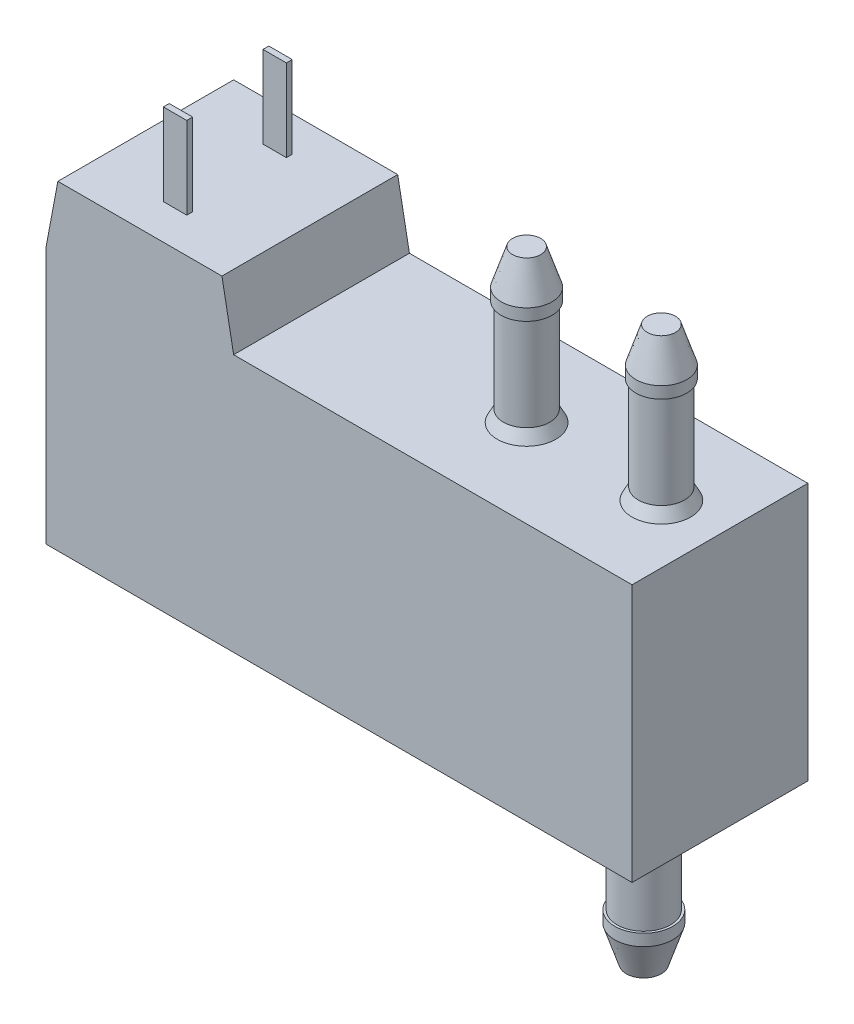
ISO-10303-21;
HEADER;
FILE_DESCRIPTION(('STEP AP214'),'2;1');
FILE_NAME('part.step','',(''),(''),'','','');
FILE_SCHEMA(('AUTOMOTIVE_DESIGN { 1 0 10303 214 1 1 1 1 }'));
ENDSEC;
DATA;
#1=APPLICATION_CONTEXT('core data for automotive mechanical design processes');
#2=APPLICATION_PROTOCOL_DEFINITION('international standard','automotive_design',2000,#1);
#3=PRODUCT_CONTEXT('',#1,'mechanical');
#4=PRODUCT('Part','Part','',(#3));
#5=PRODUCT_RELATED_PRODUCT_CATEGORY('part','',(#4));
#6=PRODUCT_DEFINITION_FORMATION('','',#4);
#7=PRODUCT_DEFINITION_CONTEXT('part definition',#1,'design');
#8=PRODUCT_DEFINITION('design','',#6,#7);
#9=PRODUCT_DEFINITION_SHAPE('','',#8);
#10=(LENGTH_UNIT() NAMED_UNIT(*) SI_UNIT(.MILLI.,.METRE.));
#11=(NAMED_UNIT(*) PLANE_ANGLE_UNIT() SI_UNIT($,.RADIAN.));
#12=(NAMED_UNIT(*) SI_UNIT($,.STERADIAN.) SOLID_ANGLE_UNIT());
#13=UNCERTAINTY_MEASURE_WITH_UNIT(LENGTH_MEASURE(1.E-05),#10,'distance_accuracy_value','');
#14=(GEOMETRIC_REPRESENTATION_CONTEXT(3) GLOBAL_UNCERTAINTY_ASSIGNED_CONTEXT((#13)) GLOBAL_UNIT_ASSIGNED_CONTEXT((#10,
#11,#12)) REPRESENTATION_CONTEXT('',''));
#15=CARTESIAN_POINT('',(0.,0.,0.));
#16=DIRECTION('',(0.,0.,1.));
#17=DIRECTION('',(1.,0.,0.));
#18=AXIS2_PLACEMENT_3D('',#15,#16,#17);
#19=CARTESIAN_POINT('',(-24.,16.3159715500328,24.359998621612));
#20=DIRECTION('',(0.,-1.,0.));
#21=DIRECTION('',(0.,0.,-1.));
#22=AXIS2_PLACEMENT_3D('',#19,#20,#21);
#23=PLANE('',#22);
#24=DIRECTION('',(1.,0.,0.));
#25=VECTOR('',#24,1.);
#26=CARTESIAN_POINT('',(-18.,16.3159715500328,4.));
#27=LINE('',#26,#25);
#28=CARTESIAN_POINT('',(-18.,16.3159715500328,4.));
#29=VERTEX_POINT('',#28);
#30=CARTESIAN_POINT('',(-16.,16.3159715500328,4.));
#31=VERTEX_POINT('',#30);
#32=EDGE_CURVE('E175',#29,#31,#27,.T.);
#33=ORIENTED_EDGE('',*,*,#32,.T.);
#34=DIRECTION('',(0.,0.,1.));
#35=VECTOR('',#34,1.);
#36=CARTESIAN_POINT('',(-16.,16.3159715500328,4.5));
#37=LINE('',#36,#35);
#38=CARTESIAN_POINT('',(-16.,16.3159715500328,4.5));
#39=VERTEX_POINT('',#38);
#40=EDGE_CURVE('E149',#31,#39,#37,.T.);
#41=ORIENTED_EDGE('',*,*,#40,.T.);
#42=DIRECTION('',(-1.,0.,0.));
#43=VECTOR('',#42,1.);
#44=CARTESIAN_POINT('',(-18.,16.3159715500328,4.5));
#45=LINE('',#44,#43);
#46=CARTESIAN_POINT('',(-18.,16.3159715500328,4.5));
#47=VERTEX_POINT('',#46);
#48=EDGE_CURVE('E165',#39,#47,#45,.T.);
#49=ORIENTED_EDGE('',*,*,#48,.T.);
#50=DIRECTION('',(0.,0.,-1.));
#51=VECTOR('',#50,1.);
#52=CARTESIAN_POINT('',(-18.,16.3159715500328,4.5));
#53=LINE('',#52,#51);
#54=EDGE_CURVE('E51',#47,#29,#53,.T.);
#55=ORIENTED_EDGE('',*,*,#54,.T.);
#56=EDGE_LOOP('',(#33,#41,#49,#55));
#57=FACE_BOUND('',#56,.T.);
#58=DIRECTION('',(0.,0.,-1.));
#59=VECTOR('',#58,1.);
#60=CARTESIAN_POINT('',(-24.,16.3159715500328,24.359998621612));
#61=LINE('',#60,#59);
#62=CARTESIAN_POINT('',(-24.,16.3159715500328,7.5));
#63=VERTEX_POINT('',#62);
#64=CARTESIAN_POINT('',(-24.,16.3159715500328,-7.5));
#65=VERTEX_POINT('',#64);
#66=EDGE_CURVE('E268',#63,#65,#61,.T.);
#67=ORIENTED_EDGE('',*,*,#66,.F.);
#68=DIRECTION('',(1.,0.,0.));
#69=VECTOR('',#68,1.);
#70=CARTESIAN_POINT('',(-24.,16.3159715500328,7.5));
#71=LINE('',#70,#69);
#72=CARTESIAN_POINT('',(-10.,16.3159715500328,7.5));
#73=VERTEX_POINT('',#72);
#74=EDGE_CURVE('E271',#63,#73,#71,.T.);
#75=ORIENTED_EDGE('',*,*,#74,.T.);
#76=DIRECTION('',(0.,0.,-1.));
#77=VECTOR('',#76,1.);
#78=CARTESIAN_POINT('',(-10.,16.3159715500328,24.359998621612));
#79=LINE('',#78,#77);
#80=CARTESIAN_POINT('',(-10.,16.3159715500328,-7.5));
#81=VERTEX_POINT('',#80);
#82=EDGE_CURVE('E280',#73,#81,#79,.T.);
#83=ORIENTED_EDGE('',*,*,#82,.T.);
#84=DIRECTION('',(-1.,0.,0.));
#85=VECTOR('',#84,1.);
#86=CARTESIAN_POINT('',(-24.,16.3159715500328,-7.5));
#87=LINE('',#86,#85);
#88=EDGE_CURVE('E264',#81,#65,#87,.T.);
#89=ORIENTED_EDGE('',*,*,#88,.T.);
#90=EDGE_LOOP('',(#67,#75,#83,#89));
#91=FACE_BOUND('',#90,.T.);
#92=DIRECTION('',(0.,0.,-1.));
#93=VECTOR('',#92,1.);
#94=CARTESIAN_POINT('',(-16.,16.3159715500328,-4.5));
#95=LINE('',#94,#93);
#96=CARTESIAN_POINT('',(-16.,16.3159715500328,-4.));
#97=VERTEX_POINT('',#96);
#98=CARTESIAN_POINT('',(-16.,16.3159715500328,-4.5));
#99=VERTEX_POINT('',#98);
#100=EDGE_CURVE('E154',#97,#99,#95,.T.);
#101=ORIENTED_EDGE('',*,*,#100,.F.);
#102=DIRECTION('',(1.,0.,0.));
#103=VECTOR('',#102,1.);
#104=CARTESIAN_POINT('',(-18.,16.3159715500328,-4.));
#105=LINE('',#104,#103);
#106=CARTESIAN_POINT('',(-18.,16.3159715500328,-4.));
#107=VERTEX_POINT('',#106);
#108=EDGE_CURVE('E188',#107,#97,#105,.T.);
#109=ORIENTED_EDGE('',*,*,#108,.F.);
#110=DIRECTION('',(0.,0.,1.));
#111=VECTOR('',#110,1.);
#112=CARTESIAN_POINT('',(-18.,16.3159715500328,-4.5));
#113=LINE('',#112,#111);
#114=CARTESIAN_POINT('',(-18.,16.3159715500328,-4.5));
#115=VERTEX_POINT('',#114);
#116=EDGE_CURVE('E198',#115,#107,#113,.T.);
#117=ORIENTED_EDGE('',*,*,#116,.F.);
#118=DIRECTION('',(-1.,0.,0.));
#119=VECTOR('',#118,1.);
#120=CARTESIAN_POINT('',(-18.,16.3159715500328,-4.5));
#121=LINE('',#120,#119);
#122=EDGE_CURVE('E59',#99,#115,#121,.T.);
#123=ORIENTED_EDGE('',*,*,#122,.F.);
#124=EDGE_LOOP('',(#101,#109,#117,#123));
#125=FACE_BOUND('',#124,.T.);
#126=ADVANCED_FACE('F36',(#57,#91,#125),#23,.F.);
#127=CARTESIAN_POINT('',(-25.,11.,7.5));
#128=DIRECTION('',(0.,-1.,0.));
#129=DIRECTION('',(0.,0.,-1.));
#130=AXIS2_PLACEMENT_3D('',#127,#128,#129);
#131=PLANE('',#130);
#132=CARTESIAN_POINT('',(20.,11.,0.));
#133=DIRECTION('',(0.,-1.,0.));
#134=DIRECTION('',(0.,0.,-1.));
#135=AXIS2_PLACEMENT_3D('',#132,#133,#134);
#136=CIRCLE('',#135,2.5);
#137=CARTESIAN_POINT('',(20.,11.,-2.5));
#138=VERTEX_POINT('',#137);
#139=EDGE_CURVE('E11',#138,#138,#136,.F.);
#140=ORIENTED_EDGE('',*,*,#139,.F.);
#141=EDGE_LOOP('',(#140));
#142=FACE_BOUND('',#141,.T.);
#143=CARTESIAN_POINT('',(8.5,11.,0.));
#144=DIRECTION('',(0.,-1.,0.));
#145=DIRECTION('',(0.,0.,-1.));
#146=AXIS2_PLACEMENT_3D('',#143,#144,#145);
#147=CIRCLE('',#146,2.5);
#148=CARTESIAN_POINT('',(8.5,11.,-2.5));
#149=VERTEX_POINT('',#148);
#150=EDGE_CURVE('E44',#149,#149,#147,.F.);
#151=ORIENTED_EDGE('',*,*,#150,.F.);
#152=EDGE_LOOP('',(#151));
#153=FACE_BOUND('',#152,.T.);
#154=DIRECTION('',(0.,0.,-1.));
#155=VECTOR('',#154,1.);
#156=CARTESIAN_POINT('',(-9.,11.,24.359998621612));
#157=LINE('',#156,#155);
#158=CARTESIAN_POINT('',(-9.,11.,7.5));
#159=VERTEX_POINT('',#158);
#160=CARTESIAN_POINT('',(-9.,11.,-7.5));
#161=VERTEX_POINT('',#160);
#162=EDGE_CURVE('E282',#159,#161,#157,.T.);
#163=ORIENTED_EDGE('',*,*,#162,.F.);
#164=DIRECTION('',(-1.,0.,0.));
#165=VECTOR('',#164,1.);
#166=CARTESIAN_POINT('',(-25.,11.,7.5));
#167=LINE('',#166,#165);
#168=CARTESIAN_POINT('',(25.,11.,7.5));
#169=VERTEX_POINT('',#168);
#170=EDGE_CURVE('E290',#169,#159,#167,.T.);
#171=ORIENTED_EDGE('',*,*,#170,.F.);
#172=DIRECTION('',(0.,0.,-1.));
#173=VECTOR('',#172,1.);
#174=CARTESIAN_POINT('',(25.,11.,7.5));
#175=LINE('',#174,#173);
#176=CARTESIAN_POINT('',(25.,11.,-7.5));
#177=VERTEX_POINT('',#176);
#178=EDGE_CURVE('E313',#169,#177,#175,.T.);
#179=ORIENTED_EDGE('',*,*,#178,.T.);
#180=DIRECTION('',(-1.,0.,0.));
#181=VECTOR('',#180,1.);
#182=CARTESIAN_POINT('',(-25.,11.,-7.5));
#183=LINE('',#182,#181);
#184=EDGE_CURVE('E301',#177,#161,#183,.T.);
#185=ORIENTED_EDGE('',*,*,#184,.T.);
#186=EDGE_LOOP('',(#163,#171,#179,#185));
#187=FACE_BOUND('',#186,.T.);
#188=ADVANCED_FACE('F320',(#142,#153,#187),#131,.F.);
#189=CARTESIAN_POINT('',(25.,-11.,7.5));
#190=DIRECTION('',(-1.,0.,0.));
#191=DIRECTION('',(0.,0.,1.));
#192=AXIS2_PLACEMENT_3D('',#189,#190,#191);
#193=PLANE('',#192);
#194=DIRECTION('',(0.,1.,0.));
#195=VECTOR('',#194,1.);
#196=CARTESIAN_POINT('',(25.,-11.,-7.5));
#197=LINE('',#196,#195);
#198=CARTESIAN_POINT('',(25.,-11.,-7.5));
#199=VERTEX_POINT('',#198);
#200=EDGE_CURVE('E278',#199,#177,#197,.T.);
#201=ORIENTED_EDGE('',*,*,#200,.T.);
#202=ORIENTED_EDGE('',*,*,#178,.F.);
#203=DIRECTION('',(0.,1.,0.));
#204=VECTOR('',#203,1.);
#205=CARTESIAN_POINT('',(25.,-11.,7.5));
#206=LINE('',#205,#204);
#207=CARTESIAN_POINT('',(25.,-11.,7.5));
#208=VERTEX_POINT('',#207);
#209=EDGE_CURVE('E287',#208,#169,#206,.T.);
#210=ORIENTED_EDGE('',*,*,#209,.F.);
#211=DIRECTION('',(0.,0.,-1.));
#212=VECTOR('',#211,1.);
#213=CARTESIAN_POINT('',(25.,-11.,7.5));
#214=LINE('',#213,#212);
#215=EDGE_CURVE('E298',#208,#199,#214,.T.);
#216=ORIENTED_EDGE('',*,*,#215,.T.);
#217=EDGE_LOOP('',(#201,#202,#210,#216));
#218=FACE_BOUND('',#217,.T.);
#219=ADVANCED_FACE('F38',(#218),#193,.F.);
#220=CARTESIAN_POINT('',(-25.,-11.,7.5));
#221=DIRECTION('',(1.,0.,0.));
#222=DIRECTION('',(0.,0.,-1.));
#223=AXIS2_PLACEMENT_3D('',#220,#221,#222);
#224=PLANE('',#223);
#225=DIRECTION('',(0.,-1.,0.));
#226=VECTOR('',#225,1.);
#227=CARTESIAN_POINT('',(-25.,-11.,-7.5));
#228=LINE('',#227,#226);
#229=CARTESIAN_POINT('',(-25.,11.,-7.5));
#230=VERTEX_POINT('',#229);
#231=CARTESIAN_POINT('',(-25.,-11.,-7.5));
#232=VERTEX_POINT('',#231);
#233=EDGE_CURVE('E303',#230,#232,#228,.T.);
#234=ORIENTED_EDGE('',*,*,#233,.T.);
#235=DIRECTION('',(0.,0.,-1.));
#236=VECTOR('',#235,1.);
#237=CARTESIAN_POINT('',(-25.,-11.,7.5));
#238=LINE('',#237,#236);
#239=CARTESIAN_POINT('',(-25.,-11.,7.5));
#240=VERTEX_POINT('',#239);
#241=EDGE_CURVE('E308',#240,#232,#238,.T.);
#242=ORIENTED_EDGE('',*,*,#241,.F.);
#243=DIRECTION('',(0.,-1.,0.));
#244=VECTOR('',#243,1.);
#245=CARTESIAN_POINT('',(-25.,-11.,7.5));
#246=LINE('',#245,#244);
#247=CARTESIAN_POINT('',(-25.,11.,7.5));
#248=VERTEX_POINT('',#247);
#249=EDGE_CURVE('E294',#248,#240,#246,.T.);
#250=ORIENTED_EDGE('',*,*,#249,.F.);
#251=DIRECTION('',(0.,0.,-1.));
#252=VECTOR('',#251,1.);
#253=CARTESIAN_POINT('',(-25.,11.,7.5));
#254=LINE('',#253,#252);
#255=EDGE_CURVE('E311',#248,#230,#254,.T.);
#256=ORIENTED_EDGE('',*,*,#255,.T.);
#257=EDGE_LOOP('',(#234,#242,#250,#256));
#258=FACE_BOUND('',#257,.T.);
#259=ADVANCED_FACE('F343',(#258),#224,.F.);
#260=CARTESIAN_POINT('',(-25.,-11.,7.5));
#261=DIRECTION('',(0.,1.,0.));
#262=DIRECTION('',(0.,0.,1.));
#263=AXIS2_PLACEMENT_3D('',#260,#261,#262);
#264=PLANE('',#263);
#265=CARTESIAN_POINT('',(18.5,-11.,0.));
#266=DIRECTION('',(0.,1.,0.));
#267=DIRECTION('',(0.,0.,1.));
#268=AXIS2_PLACEMENT_3D('',#265,#266,#267);
#269=CIRCLE('',#268,2.5);
#270=CARTESIAN_POINT('',(18.5,-11.,2.5));
#271=VERTEX_POINT('',#270);
#272=EDGE_CURVE('E213',#271,#271,#269,.T.);
#273=ORIENTED_EDGE('',*,*,#272,.T.);
#274=EDGE_LOOP('',(#273));
#275=FACE_BOUND('',#274,.T.);
#276=DIRECTION('',(1.,0.,0.));
#277=VECTOR('',#276,1.);
#278=CARTESIAN_POINT('',(-25.,-11.,-7.5));
#279=LINE('',#278,#277);
#280=EDGE_CURVE('E291',#232,#199,#279,.T.);
#281=ORIENTED_EDGE('',*,*,#280,.T.);
#282=ORIENTED_EDGE('',*,*,#215,.F.);
#283=DIRECTION('',(1.,0.,0.));
#284=VECTOR('',#283,1.);
#285=CARTESIAN_POINT('',(-25.,-11.,7.5));
#286=LINE('',#285,#284);
#287=EDGE_CURVE('E296',#240,#208,#286,.T.);
#288=ORIENTED_EDGE('',*,*,#287,.F.);
#289=ORIENTED_EDGE('',*,*,#241,.T.);
#290=EDGE_LOOP('',(#281,#282,#288,#289));
#291=FACE_BOUND('',#290,.T.);
#292=ADVANCED_FACE('F350',(#275,#291),#264,.F.);
#293=CARTESIAN_POINT('',(0.,0.,7.5));
#294=DIRECTION('',(0.,0.,-1.));
#295=DIRECTION('',(-1.,0.,0.));
#296=AXIS2_PLACEMENT_3D('',#293,#294,#295);
#297=PLANE('',#296);
#298=ORIENTED_EDGE('',*,*,#209,.T.);
#299=ORIENTED_EDGE('',*,*,#170,.T.);
#300=DIRECTION('',(0.18486987713459,-0.982763007305547,0.));
#301=VECTOR('',#300,1.);
#302=CARTESIAN_POINT('',(-10.,16.3159715500328,7.5));
#303=LINE('',#302,#301);
#304=EDGE_CURVE('E274',#73,#159,#303,.T.);
#305=ORIENTED_EDGE('',*,*,#304,.F.);
#306=ORIENTED_EDGE('',*,*,#74,.F.);
#307=DIRECTION('',(0.18486987713459,0.982763007305547,0.));
#308=VECTOR('',#307,1.);
#309=CARTESIAN_POINT('',(-25.,11.,7.5));
#310=LINE('',#309,#308);
#311=EDGE_CURVE('E275',#248,#63,#310,.T.);
#312=ORIENTED_EDGE('',*,*,#311,.F.);
#313=ORIENTED_EDGE('',*,*,#249,.T.);
#314=ORIENTED_EDGE('',*,*,#287,.T.);
#315=EDGE_LOOP('',(#298,#299,#305,#306,#312,#313,#314));
#316=FACE_BOUND('',#315,.T.);
#317=ADVANCED_FACE('F327',(#316),#297,.F.);
#318=CARTESIAN_POINT('',(0.,0.,-7.5));
#319=DIRECTION('',(0.,0.,-1.));
#320=DIRECTION('',(-1.,0.,0.));
#321=AXIS2_PLACEMENT_3D('',#318,#319,#320);
#322=PLANE('',#321);
#323=ORIENTED_EDGE('',*,*,#200,.F.);
#324=ORIENTED_EDGE('',*,*,#280,.F.);
#325=ORIENTED_EDGE('',*,*,#233,.F.);
#326=DIRECTION('',(-0.18486987713459,-0.982763007305547,0.));
#327=VECTOR('',#326,1.);
#328=CARTESIAN_POINT('',(-25.,11.,-7.5));
#329=LINE('',#328,#327);
#330=EDGE_CURVE('E265',#65,#230,#329,.T.);
#331=ORIENTED_EDGE('',*,*,#330,.F.);
#332=ORIENTED_EDGE('',*,*,#88,.F.);
#333=DIRECTION('',(-0.18486987713459,0.982763007305547,0.));
#334=VECTOR('',#333,1.);
#335=CARTESIAN_POINT('',(-10.,16.3159715500328,-7.5));
#336=LINE('',#335,#334);
#337=EDGE_CURVE('E261',#161,#81,#336,.T.);
#338=ORIENTED_EDGE('',*,*,#337,.F.);
#339=ORIENTED_EDGE('',*,*,#184,.F.);
#340=EDGE_LOOP('',(#323,#324,#325,#331,#332,#338,#339));
#341=FACE_BOUND('',#340,.T.);
#342=ADVANCED_FACE('F347',(#341),#322,.T.);
#343=CARTESIAN_POINT('',(-25.,11.,24.359998621612));
#344=DIRECTION('',(0.982763007305546,-0.18486987713459,0.));
#345=DIRECTION('',(0.18486987713459,0.982763007305547,0.));
#346=AXIS2_PLACEMENT_3D('',#343,#344,#345);
#347=PLANE('',#346);
#348=ORIENTED_EDGE('',*,*,#255,.F.);
#349=ORIENTED_EDGE('',*,*,#311,.T.);
#350=ORIENTED_EDGE('',*,*,#66,.T.);
#351=ORIENTED_EDGE('',*,*,#330,.T.);
#352=EDGE_LOOP('',(#348,#349,#350,#351));
#353=FACE_BOUND('',#352,.T.);
#354=ADVANCED_FACE('F339',(#353),#347,.F.);
#355=CARTESIAN_POINT('',(-10.,16.3159715500328,24.359998621612));
#356=DIRECTION('',(-0.982763007305546,-0.18486987713459,0.));
#357=DIRECTION('',(0.18486987713459,-0.982763007305547,0.));
#358=AXIS2_PLACEMENT_3D('',#355,#356,#357);
#359=PLANE('',#358);
#360=ORIENTED_EDGE('',*,*,#82,.F.);
#361=ORIENTED_EDGE('',*,*,#304,.T.);
#362=ORIENTED_EDGE('',*,*,#162,.T.);
#363=ORIENTED_EDGE('',*,*,#337,.T.);
#364=EDGE_LOOP('',(#360,#361,#362,#363));
#365=FACE_BOUND('',#364,.T.);
#366=ADVANCED_FACE('F331',(#365),#359,.F.);
#367=CARTESIAN_POINT('',(8.5,11.,0.));
#368=DIRECTION('',(0.,-1.,0.));
#369=DIRECTION('',(0.,0.,-1.));
#370=AXIS2_PLACEMENT_3D('',#367,#368,#369);
#371=CONICAL_SURFACE('',#370,2.5,0.483635840304611);
#372=CARTESIAN_POINT('',(8.5,12.,0.));
#373=DIRECTION('',(0.,1.,0.));
#374=DIRECTION('',(0.,0.,1.));
#375=AXIS2_PLACEMENT_3D('',#372,#373,#374);
#376=CIRCLE('',#375,1.9747590886987);
#377=CARTESIAN_POINT('',(8.5,12.,1.9747590886987));
#378=VERTEX_POINT('',#377);
#379=EDGE_CURVE('E258',#378,#378,#376,.T.);
#380=ORIENTED_EDGE('',*,*,#379,.F.);
#381=EDGE_LOOP('',(#380));
#382=FACE_BOUND('',#381,.T.);
#383=ORIENTED_EDGE('',*,*,#150,.T.);
#384=EDGE_LOOP('',(#383));
#385=FACE_BOUND('',#384,.T.);
#386=ADVANCED_FACE('F318',(#382,#385),#371,.T.);
#387=CARTESIAN_POINT('',(8.5,24.,0.));
#388=DIRECTION('',(0.,1.,0.));
#389=DIRECTION('',(0.,0.,1.));
#390=AXIS2_PLACEMENT_3D('',#387,#388,#389);
#391=CYLINDRICAL_SURFACE('',#390,1.9747590886987);
#392=CARTESIAN_POINT('',(8.5,20.,0.));
#393=DIRECTION('',(0.,1.,0.));
#394=DIRECTION('',(0.,0.,1.));
#395=AXIS2_PLACEMENT_3D('',#392,#393,#394);
#396=CIRCLE('',#395,1.9747590886987);
#397=CARTESIAN_POINT('',(8.5,20.,1.9747590886987));
#398=VERTEX_POINT('',#397);
#399=EDGE_CURVE('E255',#398,#398,#396,.T.);
#400=ORIENTED_EDGE('',*,*,#399,.F.);
#401=EDGE_LOOP('',(#400));
#402=FACE_BOUND('',#401,.T.);
#403=ORIENTED_EDGE('',*,*,#379,.T.);
#404=EDGE_LOOP('',(#403));
#405=FACE_BOUND('',#404,.T.);
#406=ADVANCED_FACE('F450',(#402,#405),#391,.T.);
#407=CARTESIAN_POINT('',(10.4747590886987,20.,0.));
#408=DIRECTION('',(0.,1.,0.));
#409=DIRECTION('',(0.,0.,1.));
#410=AXIS2_PLACEMENT_3D('',#407,#408,#409);
#411=PLANE('',#410);
#412=CARTESIAN_POINT('',(8.5,20.,0.));
#413=DIRECTION('',(0.,1.,0.));
#414=DIRECTION('',(0.,0.,1.));
#415=AXIS2_PLACEMENT_3D('',#412,#413,#414);
#416=CIRCLE('',#415,2.1747590886987);
#417=CARTESIAN_POINT('',(8.5,20.,2.1747590886987));
#418=VERTEX_POINT('',#417);
#419=EDGE_CURVE('E252',#418,#418,#416,.T.);
#420=ORIENTED_EDGE('',*,*,#419,.F.);
#421=EDGE_LOOP('',(#420));
#422=FACE_BOUND('',#421,.T.);
#423=ORIENTED_EDGE('',*,*,#399,.T.);
#424=EDGE_LOOP('',(#423));
#425=FACE_BOUND('',#424,.T.);
#426=ADVANCED_FACE('F446',(#422,#425),#411,.F.);
#427=CARTESIAN_POINT('',(8.5,24.,0.));
#428=DIRECTION('',(0.,1.,0.));
#429=DIRECTION('',(0.,0.,1.));
#430=AXIS2_PLACEMENT_3D('',#427,#428,#429);
#431=CYLINDRICAL_SURFACE('',#430,2.1747590886987);
#432=CARTESIAN_POINT('',(8.5,21.,0.));
#433=DIRECTION('',(0.,1.,0.));
#434=DIRECTION('',(0.,0.,1.));
#435=AXIS2_PLACEMENT_3D('',#432,#433,#434);
#436=CIRCLE('',#435,2.1747590886987);
#437=CARTESIAN_POINT('',(8.5,21.,2.1747590886987));
#438=VERTEX_POINT('',#437);
#439=EDGE_CURVE('E249',#438,#438,#436,.T.);
#440=ORIENTED_EDGE('',*,*,#439,.F.);
#441=EDGE_LOOP('',(#440));
#442=FACE_BOUND('',#441,.T.);
#443=ORIENTED_EDGE('',*,*,#419,.T.);
#444=EDGE_LOOP('',(#443));
#445=FACE_BOUND('',#444,.T.);
#446=ADVANCED_FACE('F442',(#442,#445),#431,.T.);
#447=CARTESIAN_POINT('',(8.5,21.,0.));
#448=DIRECTION('',(0.,-1.,0.));
#449=DIRECTION('',(0.,0.,-1.));
#450=AXIS2_PLACEMENT_3D('',#447,#448,#449);
#451=CONICAL_SURFACE('',#450,2.1747590886987,0.314159265358973);
#452=CARTESIAN_POINT('',(8.5,24.,0.));
#453=DIRECTION('',(0.,1.,0.));
#454=DIRECTION('',(0.,0.,1.));
#455=AXIS2_PLACEMENT_3D('',#452,#453,#454);
#456=CIRCLE('',#455,1.2);
#457=CARTESIAN_POINT('',(8.5,24.,1.2));
#458=VERTEX_POINT('',#457);
#459=EDGE_CURVE('E246',#458,#458,#456,.T.);
#460=ORIENTED_EDGE('',*,*,#459,.F.);
#461=EDGE_LOOP('',(#460));
#462=FACE_BOUND('',#461,.T.);
#463=ORIENTED_EDGE('',*,*,#439,.T.);
#464=EDGE_LOOP('',(#463));
#465=FACE_BOUND('',#464,.T.);
#466=ADVANCED_FACE('F438',(#462,#465),#451,.T.);
#467=CARTESIAN_POINT('',(9.7,24.,0.));
#468=DIRECTION('',(0.,-1.,0.));
#469=DIRECTION('',(0.,0.,-1.));
#470=AXIS2_PLACEMENT_3D('',#467,#468,#469);
#471=PLANE('',#470);
#472=ORIENTED_EDGE('',*,*,#459,.T.);
#473=EDGE_LOOP('',(#472));
#474=FACE_BOUND('',#473,.T.);
#475=ADVANCED_FACE('F434',(#474),#471,.F.);
#476=CARTESIAN_POINT('',(20.,11.,0.));
#477=DIRECTION('',(0.,-1.,0.));
#478=DIRECTION('',(0.,0.,-1.));
#479=AXIS2_PLACEMENT_3D('',#476,#477,#478);
#480=CONICAL_SURFACE('',#479,2.5,0.483635840304611);
#481=CARTESIAN_POINT('',(20.,12.,0.));
#482=DIRECTION('',(0.,1.,0.));
#483=DIRECTION('',(0.,0.,1.));
#484=AXIS2_PLACEMENT_3D('',#481,#482,#483);
#485=CIRCLE('',#484,1.9747590886987);
#486=CARTESIAN_POINT('',(20.,12.,1.9747590886987));
#487=VERTEX_POINT('',#486);
#488=EDGE_CURVE('E243',#487,#487,#485,.T.);
#489=ORIENTED_EDGE('',*,*,#488,.F.);
#490=EDGE_LOOP('',(#489));
#491=FACE_BOUND('',#490,.T.);
#492=ORIENTED_EDGE('',*,*,#139,.T.);
#493=EDGE_LOOP('',(#492));
#494=FACE_BOUND('',#493,.T.);
#495=ADVANCED_FACE('F430',(#491,#494),#480,.T.);
#496=CARTESIAN_POINT('',(20.,24.,0.));
#497=DIRECTION('',(0.,1.,0.));
#498=DIRECTION('',(0.,0.,1.));
#499=AXIS2_PLACEMENT_3D('',#496,#497,#498);
#500=CYLINDRICAL_SURFACE('',#499,1.9747590886987);
#501=CARTESIAN_POINT('',(20.,20.,0.));
#502=DIRECTION('',(0.,1.,0.));
#503=DIRECTION('',(0.,0.,1.));
#504=AXIS2_PLACEMENT_3D('',#501,#502,#503);
#505=CIRCLE('',#504,1.9747590886987);
#506=CARTESIAN_POINT('',(20.,20.,1.9747590886987));
#507=VERTEX_POINT('',#506);
#508=EDGE_CURVE('E240',#507,#507,#505,.T.);
#509=ORIENTED_EDGE('',*,*,#508,.F.);
#510=EDGE_LOOP('',(#509));
#511=FACE_BOUND('',#510,.T.);
#512=ORIENTED_EDGE('',*,*,#488,.T.);
#513=EDGE_LOOP('',(#512));
#514=FACE_BOUND('',#513,.T.);
#515=ADVANCED_FACE('F426',(#511,#514),#500,.T.);
#516=CARTESIAN_POINT('',(21.9747590886987,20.,0.));
#517=DIRECTION('',(0.,1.,0.));
#518=DIRECTION('',(0.,0.,1.));
#519=AXIS2_PLACEMENT_3D('',#516,#517,#518);
#520=PLANE('',#519);
#521=CARTESIAN_POINT('',(20.,20.,0.));
#522=DIRECTION('',(0.,1.,0.));
#523=DIRECTION('',(0.,0.,1.));
#524=AXIS2_PLACEMENT_3D('',#521,#522,#523);
#525=CIRCLE('',#524,2.1747590886987);
#526=CARTESIAN_POINT('',(20.,20.,2.1747590886987));
#527=VERTEX_POINT('',#526);
#528=EDGE_CURVE('E237',#527,#527,#525,.T.);
#529=ORIENTED_EDGE('',*,*,#528,.F.);
#530=EDGE_LOOP('',(#529));
#531=FACE_BOUND('',#530,.T.);
#532=ORIENTED_EDGE('',*,*,#508,.T.);
#533=EDGE_LOOP('',(#532));
#534=FACE_BOUND('',#533,.T.);
#535=ADVANCED_FACE('F422',(#531,#534),#520,.F.);
#536=CARTESIAN_POINT('',(20.,24.,0.));
#537=DIRECTION('',(0.,1.,0.));
#538=DIRECTION('',(0.,0.,1.));
#539=AXIS2_PLACEMENT_3D('',#536,#537,#538);
#540=CYLINDRICAL_SURFACE('',#539,2.1747590886987);
#541=CARTESIAN_POINT('',(20.,21.,0.));
#542=DIRECTION('',(0.,1.,0.));
#543=DIRECTION('',(0.,0.,1.));
#544=AXIS2_PLACEMENT_3D('',#541,#542,#543);
#545=CIRCLE('',#544,2.1747590886987);
#546=CARTESIAN_POINT('',(20.,21.,2.1747590886987));
#547=VERTEX_POINT('',#546);
#548=EDGE_CURVE('E234',#547,#547,#545,.T.);
#549=ORIENTED_EDGE('',*,*,#548,.F.);
#550=EDGE_LOOP('',(#549));
#551=FACE_BOUND('',#550,.T.);
#552=ORIENTED_EDGE('',*,*,#528,.T.);
#553=EDGE_LOOP('',(#552));
#554=FACE_BOUND('',#553,.T.);
#555=ADVANCED_FACE('F418',(#551,#554),#540,.T.);
#556=CARTESIAN_POINT('',(20.,21.,0.));
#557=DIRECTION('',(0.,-1.,0.));
#558=DIRECTION('',(0.,0.,-1.));
#559=AXIS2_PLACEMENT_3D('',#556,#557,#558);
#560=CONICAL_SURFACE('',#559,2.1747590886987,0.314159265358974);
#561=CARTESIAN_POINT('',(20.,24.,0.));
#562=DIRECTION('',(0.,1.,0.));
#563=DIRECTION('',(0.,0.,1.));
#564=AXIS2_PLACEMENT_3D('',#561,#562,#563);
#565=CIRCLE('',#564,1.2);
#566=CARTESIAN_POINT('',(20.,24.,1.2));
#567=VERTEX_POINT('',#566);
#568=EDGE_CURVE('E231',#567,#567,#565,.T.);
#569=ORIENTED_EDGE('',*,*,#568,.F.);
#570=EDGE_LOOP('',(#569));
#571=FACE_BOUND('',#570,.T.);
#572=ORIENTED_EDGE('',*,*,#548,.T.);
#573=EDGE_LOOP('',(#572));
#574=FACE_BOUND('',#573,.T.);
#575=ADVANCED_FACE('F414',(#571,#574),#560,.T.);
#576=CARTESIAN_POINT('',(21.2,24.,0.));
#577=DIRECTION('',(0.,-1.,0.));
#578=DIRECTION('',(0.,0.,-1.));
#579=AXIS2_PLACEMENT_3D('',#576,#577,#578);
#580=PLANE('',#579);
#581=ORIENTED_EDGE('',*,*,#568,.T.);
#582=EDGE_LOOP('',(#581));
#583=FACE_BOUND('',#582,.T.);
#584=ADVANCED_FACE('F410',(#583),#580,.F.);
#585=CARTESIAN_POINT('',(18.5,-24.,0.));
#586=DIRECTION('',(0.,-1.,0.));
#587=DIRECTION('',(0.,0.,-1.));
#588=AXIS2_PLACEMENT_3D('',#585,#586,#587);
#589=PLANE('',#588);
#590=CARTESIAN_POINT('',(18.5,-24.,0.));
#591=DIRECTION('',(0.,1.,0.));
#592=DIRECTION('',(0.,0.,1.));
#593=AXIS2_PLACEMENT_3D('',#590,#591,#592);
#594=CIRCLE('',#593,1.5);
#595=CARTESIAN_POINT('',(18.5,-24.,1.5));
#596=VERTEX_POINT('',#595);
#597=EDGE_CURVE('E228',#596,#596,#594,.T.);
#598=ORIENTED_EDGE('',*,*,#597,.F.);
#599=EDGE_LOOP('',(#598));
#600=FACE_BOUND('',#599,.T.);
#601=ADVANCED_FACE('F406',(#600),#589,.T.);
#602=CARTESIAN_POINT('',(18.5,-21.,0.));
#603=DIRECTION('',(0.,1.,0.));
#604=DIRECTION('',(0.,0.,1.));
#605=AXIS2_PLACEMENT_3D('',#602,#603,#604);
#606=CONICAL_SURFACE('',#605,2.4747590886987,0.314159265358974);
#607=ORIENTED_EDGE('',*,*,#597,.T.);
#608=EDGE_LOOP('',(#607));
#609=FACE_BOUND('',#608,.T.);
#610=CARTESIAN_POINT('',(18.5,-21.,0.));
#611=DIRECTION('',(0.,1.,0.));
#612=DIRECTION('',(0.,0.,1.));
#613=AXIS2_PLACEMENT_3D('',#610,#611,#612);
#614=CIRCLE('',#613,2.4747590886987);
#615=CARTESIAN_POINT('',(18.5,-21.,2.4747590886987));
#616=VERTEX_POINT('',#615);
#617=EDGE_CURVE('E225',#616,#616,#614,.T.);
#618=ORIENTED_EDGE('',*,*,#617,.F.);
#619=EDGE_LOOP('',(#618));
#620=FACE_BOUND('',#619,.T.);
#621=ADVANCED_FACE('F402',(#609,#620),#606,.T.);
#622=CARTESIAN_POINT('',(18.5,-11.,0.));
#623=DIRECTION('',(0.,1.,0.));
#624=DIRECTION('',(0.,0.,1.));
#625=AXIS2_PLACEMENT_3D('',#622,#623,#624);
#626=CYLINDRICAL_SURFACE('',#625,2.4747590886987);
#627=ORIENTED_EDGE('',*,*,#617,.T.);
#628=EDGE_LOOP('',(#627));
#629=FACE_BOUND('',#628,.T.);
#630=CARTESIAN_POINT('',(18.5,-20.,0.));
#631=DIRECTION('',(0.,1.,0.));
#632=DIRECTION('',(0.,0.,1.));
#633=AXIS2_PLACEMENT_3D('',#630,#631,#632);
#634=CIRCLE('',#633,2.4747590886987);
#635=CARTESIAN_POINT('',(18.5,-20.,2.4747590886987));
#636=VERTEX_POINT('',#635);
#637=EDGE_CURVE('E222',#636,#636,#634,.T.);
#638=ORIENTED_EDGE('',*,*,#637,.F.);
#639=EDGE_LOOP('',(#638));
#640=FACE_BOUND('',#639,.T.);
#641=ADVANCED_FACE('F398',(#629,#640),#626,.T.);
#642=CARTESIAN_POINT('',(16.0252409113013,-20.,0.));
#643=DIRECTION('',(0.,1.,0.));
#644=DIRECTION('',(0.,0.,1.));
#645=AXIS2_PLACEMENT_3D('',#642,#643,#644);
#646=PLANE('',#645);
#647=ORIENTED_EDGE('',*,*,#637,.T.);
#648=EDGE_LOOP('',(#647));
#649=FACE_BOUND('',#648,.T.);
#650=CARTESIAN_POINT('',(18.5,-20.,0.));
#651=DIRECTION('',(0.,1.,0.));
#652=DIRECTION('',(0.,0.,1.));
#653=AXIS2_PLACEMENT_3D('',#650,#651,#652);
#654=CIRCLE('',#653,2.27475908869871);
#655=CARTESIAN_POINT('',(18.5,-20.,2.27475908869871));
#656=VERTEX_POINT('',#655);
#657=EDGE_CURVE('E219',#656,#656,#654,.T.);
#658=ORIENTED_EDGE('',*,*,#657,.F.);
#659=EDGE_LOOP('',(#658));
#660=FACE_BOUND('',#659,.T.);
#661=ADVANCED_FACE('F391',(#649,#660),#646,.T.);
#662=CARTESIAN_POINT('',(18.5,-11.,0.));
#663=DIRECTION('',(0.,1.,0.));
#664=DIRECTION('',(0.,0.,1.));
#665=AXIS2_PLACEMENT_3D('',#662,#663,#664);
#666=CYLINDRICAL_SURFACE('',#665,2.27475908869871);
#667=ORIENTED_EDGE('',*,*,#657,.T.);
#668=EDGE_LOOP('',(#667));
#669=FACE_BOUND('',#668,.T.);
#670=CARTESIAN_POINT('',(18.5,-12.,0.));
#671=DIRECTION('',(0.,1.,0.));
#672=DIRECTION('',(0.,0.,1.));
#673=AXIS2_PLACEMENT_3D('',#670,#671,#672);
#674=CIRCLE('',#673,2.27475908869871);
#675=CARTESIAN_POINT('',(18.5,-12.,2.27475908869871));
#676=VERTEX_POINT('',#675);
#677=EDGE_CURVE('E216',#676,#676,#674,.T.);
#678=ORIENTED_EDGE('',*,*,#677,.F.);
#679=EDGE_LOOP('',(#678));
#680=FACE_BOUND('',#679,.T.);
#681=ADVANCED_FACE('F381',(#669,#680),#666,.T.);
#682=CARTESIAN_POINT('',(18.5,-11.,0.));
#683=DIRECTION('',(0.,1.,0.));
#684=DIRECTION('',(0.,0.,1.));
#685=AXIS2_PLACEMENT_3D('',#682,#683,#684);
#686=CONICAL_SURFACE('',#685,2.5,0.221543733358706);
#687=ORIENTED_EDGE('',*,*,#677,.T.);
#688=EDGE_LOOP('',(#687));
#689=FACE_BOUND('',#688,.T.);
#690=ORIENTED_EDGE('',*,*,#272,.F.);
#691=EDGE_LOOP('',(#690));
#692=FACE_BOUND('',#691,.T.);
#693=ADVANCED_FACE('F378',(#689,#692),#686,.T.);
#694=CARTESIAN_POINT('',(-16.,23.3159715500328,-4.5));
#695=DIRECTION('',(-1.,0.,0.));
#696=DIRECTION('',(0.,0.,1.));
#697=AXIS2_PLACEMENT_3D('',#694,#695,#696);
#698=PLANE('',#697);
#699=ORIENTED_EDGE('',*,*,#100,.T.);
#700=DIRECTION('',(0.,-1.,0.));
#701=VECTOR('',#700,1.);
#702=CARTESIAN_POINT('',(-16.,23.3159715500328,-4.5));
#703=LINE('',#702,#701);
#704=CARTESIAN_POINT('',(-16.,23.3159715500328,-4.5));
#705=VERTEX_POINT('',#704);
#706=EDGE_CURVE('E211',#705,#99,#703,.T.);
#707=ORIENTED_EDGE('',*,*,#706,.F.);
#708=DIRECTION('',(0.,0.,-1.));
#709=VECTOR('',#708,1.);
#710=CARTESIAN_POINT('',(-16.,23.3159715500328,-4.5));
#711=LINE('',#710,#709);
#712=CARTESIAN_POINT('',(-16.,23.3159715500328,-4.));
#713=VERTEX_POINT('',#712);
#714=EDGE_CURVE('E184',#713,#705,#711,.T.);
#715=ORIENTED_EDGE('',*,*,#714,.F.);
#716=DIRECTION('',(0.,-1.,0.));
#717=VECTOR('',#716,1.);
#718=CARTESIAN_POINT('',(-16.,23.3159715500328,-4.));
#719=LINE('',#718,#717);
#720=EDGE_CURVE('E194',#713,#97,#719,.T.);
#721=ORIENTED_EDGE('',*,*,#720,.T.);
#722=EDGE_LOOP('',(#699,#707,#715,#721));
#723=FACE_BOUND('',#722,.T.);
#724=ADVANCED_FACE('F380',(#723),#698,.F.);
#725=CARTESIAN_POINT('',(-18.,23.3159715500328,-4.5));
#726=DIRECTION('',(0.,0.,1.));
#727=DIRECTION('',(1.,0.,0.));
#728=AXIS2_PLACEMENT_3D('',#725,#726,#727);
#729=PLANE('',#728);
#730=ORIENTED_EDGE('',*,*,#122,.T.);
#731=DIRECTION('',(0.,-1.,0.));
#732=VECTOR('',#731,1.);
#733=CARTESIAN_POINT('',(-18.,23.3159715500328,-4.5));
#734=LINE('',#733,#732);
#735=CARTESIAN_POINT('',(-18.,23.3159715500328,-4.5));
#736=VERTEX_POINT('',#735);
#737=EDGE_CURVE('E208',#736,#115,#734,.T.);
#738=ORIENTED_EDGE('',*,*,#737,.F.);
#739=DIRECTION('',(-1.,0.,0.));
#740=VECTOR('',#739,1.);
#741=CARTESIAN_POINT('',(-18.,23.3159715500328,-4.5));
#742=LINE('',#741,#740);
#743=EDGE_CURVE('E187',#705,#736,#742,.T.);
#744=ORIENTED_EDGE('',*,*,#743,.F.);
#745=ORIENTED_EDGE('',*,*,#706,.T.);
#746=EDGE_LOOP('',(#730,#738,#744,#745));
#747=FACE_BOUND('',#746,.T.);
#748=ADVANCED_FACE('F388',(#747),#729,.F.);
#749=CARTESIAN_POINT('',(-18.,23.3159715500328,-4.5));
#750=DIRECTION('',(1.,0.,0.));
#751=DIRECTION('',(0.,0.,-1.));
#752=AXIS2_PLACEMENT_3D('',#749,#750,#751);
#753=PLANE('',#752);
#754=ORIENTED_EDGE('',*,*,#116,.T.);
#755=DIRECTION('',(0.,-1.,0.));
#756=VECTOR('',#755,1.);
#757=CARTESIAN_POINT('',(-18.,23.3159715500328,-4.));
#758=LINE('',#757,#756);
#759=CARTESIAN_POINT('',(-18.,23.3159715500328,-4.));
#760=VERTEX_POINT('',#759);
#761=EDGE_CURVE('E205',#760,#107,#758,.T.);
#762=ORIENTED_EDGE('',*,*,#761,.F.);
#763=DIRECTION('',(0.,0.,1.));
#764=VECTOR('',#763,1.);
#765=CARTESIAN_POINT('',(-18.,23.3159715500328,-4.5));
#766=LINE('',#765,#764);
#767=EDGE_CURVE('E190',#736,#760,#766,.T.);
#768=ORIENTED_EDGE('',*,*,#767,.F.);
#769=ORIENTED_EDGE('',*,*,#737,.T.);
#770=EDGE_LOOP('',(#754,#762,#768,#769));
#771=FACE_BOUND('',#770,.T.);
#772=ADVANCED_FACE('F548',(#771),#753,.F.);
#773=CARTESIAN_POINT('',(-18.,23.3159715500328,-4.));
#774=DIRECTION('',(0.,0.,-1.));
#775=DIRECTION('',(-1.,0.,0.));
#776=AXIS2_PLACEMENT_3D('',#773,#774,#775);
#777=PLANE('',#776);
#778=ORIENTED_EDGE('',*,*,#108,.T.);
#779=ORIENTED_EDGE('',*,*,#720,.F.);
#780=DIRECTION('',(1.,0.,0.));
#781=VECTOR('',#780,1.);
#782=CARTESIAN_POINT('',(-18.,23.3159715500328,-4.));
#783=LINE('',#782,#781);
#784=EDGE_CURVE('E192',#760,#713,#783,.T.);
#785=ORIENTED_EDGE('',*,*,#784,.F.);
#786=ORIENTED_EDGE('',*,*,#761,.T.);
#787=EDGE_LOOP('',(#778,#779,#785,#786));
#788=FACE_BOUND('',#787,.T.);
#789=ADVANCED_FACE('F557',(#788),#777,.F.);
#790=CARTESIAN_POINT('',(0.,23.3159715500328,0.));
#791=DIRECTION('',(0.,1.,0.));
#792=DIRECTION('',(0.,0.,1.));
#793=AXIS2_PLACEMENT_3D('',#790,#791,#792);
#794=PLANE('',#793);
#795=ORIENTED_EDGE('',*,*,#714,.T.);
#796=ORIENTED_EDGE('',*,*,#743,.T.);
#797=ORIENTED_EDGE('',*,*,#767,.T.);
#798=ORIENTED_EDGE('',*,*,#784,.T.);
#799=EDGE_LOOP('',(#795,#796,#797,#798));
#800=FACE_BOUND('',#799,.T.);
#801=ADVANCED_FACE('F567',(#800),#794,.T.);
#802=CARTESIAN_POINT('',(-16.,23.3159715500328,4.5));
#803=DIRECTION('',(1.,0.,0.));
#804=DIRECTION('',(0.,0.,-1.));
#805=AXIS2_PLACEMENT_3D('',#802,#803,#804);
#806=PLANE('',#805);
#807=ORIENTED_EDGE('',*,*,#40,.F.);
#808=DIRECTION('',(0.,-1.,0.));
#809=VECTOR('',#808,1.);
#810=CARTESIAN_POINT('',(-16.,23.3159715500328,4.));
#811=LINE('',#810,#809);
#812=CARTESIAN_POINT('',(-16.,23.3159715500328,4.));
#813=VERTEX_POINT('',#812);
#814=EDGE_CURVE('E143',#813,#31,#811,.T.);
#815=ORIENTED_EDGE('',*,*,#814,.F.);
#816=DIRECTION('',(0.,0.,1.));
#817=VECTOR('',#816,1.);
#818=CARTESIAN_POINT('',(-16.,23.3159715500328,4.5));
#819=LINE('',#818,#817);
#820=CARTESIAN_POINT('',(-16.,23.3159715500328,4.5));
#821=VERTEX_POINT('',#820);
#822=EDGE_CURVE('E146',#813,#821,#819,.T.);
#823=ORIENTED_EDGE('',*,*,#822,.T.);
#824=DIRECTION('',(0.,-1.,0.));
#825=VECTOR('',#824,1.);
#826=CARTESIAN_POINT('',(-16.,23.3159715500328,4.5));
#827=LINE('',#826,#825);
#828=EDGE_CURVE('E173',#821,#39,#827,.T.);
#829=ORIENTED_EDGE('',*,*,#828,.T.);
#830=EDGE_LOOP('',(#807,#815,#823,#829));
#831=FACE_BOUND('',#830,.T.);
#832=ADVANCED_FACE('F145',(#831),#806,.T.);
#833=CARTESIAN_POINT('',(-18.,23.3159715500328,4.));
#834=DIRECTION('',(0.,0.,-1.));
#835=DIRECTION('',(-1.,0.,0.));
#836=AXIS2_PLACEMENT_3D('',#833,#834,#835);
#837=PLANE('',#836);
#838=ORIENTED_EDGE('',*,*,#32,.F.);
#839=DIRECTION('',(0.,-1.,0.));
#840=VECTOR('',#839,1.);
#841=CARTESIAN_POINT('',(-18.,23.3159715500328,4.));
#842=LINE('',#841,#840);
#843=CARTESIAN_POINT('',(-18.,23.3159715500328,4.));
#844=VERTEX_POINT('',#843);
#845=EDGE_CURVE('E155',#844,#29,#842,.T.);
#846=ORIENTED_EDGE('',*,*,#845,.F.);
#847=DIRECTION('',(1.,0.,0.));
#848=VECTOR('',#847,1.);
#849=CARTESIAN_POINT('',(-18.,23.3159715500328,4.));
#850=LINE('',#849,#848);
#851=EDGE_CURVE('E161',#844,#813,#850,.T.);
#852=ORIENTED_EDGE('',*,*,#851,.T.);
#853=ORIENTED_EDGE('',*,*,#814,.T.);
#854=EDGE_LOOP('',(#838,#846,#852,#853));
#855=FACE_BOUND('',#854,.T.);
#856=ADVANCED_FACE('F167',(#855),#837,.T.);
#857=CARTESIAN_POINT('',(-18.,23.3159715500328,4.5));
#858=DIRECTION('',(-1.,0.,0.));
#859=DIRECTION('',(0.,0.,1.));
#860=AXIS2_PLACEMENT_3D('',#857,#858,#859);
#861=PLANE('',#860);
#862=ORIENTED_EDGE('',*,*,#54,.F.);
#863=DIRECTION('',(0.,-1.,0.));
#864=VECTOR('',#863,1.);
#865=CARTESIAN_POINT('',(-18.,23.3159715500328,4.5));
#866=LINE('',#865,#864);
#867=CARTESIAN_POINT('',(-18.,23.3159715500328,4.5));
#868=VERTEX_POINT('',#867);
#869=EDGE_CURVE('E181',#868,#47,#866,.T.);
#870=ORIENTED_EDGE('',*,*,#869,.F.);
#871=DIRECTION('',(0.,0.,-1.));
#872=VECTOR('',#871,1.);
#873=CARTESIAN_POINT('',(-18.,23.3159715500328,4.5));
#874=LINE('',#873,#872);
#875=EDGE_CURVE('E168',#868,#844,#874,.T.);
#876=ORIENTED_EDGE('',*,*,#875,.T.);
#877=ORIENTED_EDGE('',*,*,#845,.T.);
#878=EDGE_LOOP('',(#862,#870,#876,#877));
#879=FACE_BOUND('',#878,.T.);
#880=ADVANCED_FACE('F600',(#879),#861,.T.);
#881=CARTESIAN_POINT('',(-18.,23.3159715500328,4.5));
#882=DIRECTION('',(0.,0.,1.));
#883=DIRECTION('',(1.,0.,0.));
#884=AXIS2_PLACEMENT_3D('',#881,#882,#883);
#885=PLANE('',#884);
#886=ORIENTED_EDGE('',*,*,#48,.F.);
#887=ORIENTED_EDGE('',*,*,#828,.F.);
#888=DIRECTION('',(-1.,0.,0.));
#889=VECTOR('',#888,1.);
#890=CARTESIAN_POINT('',(-18.,23.3159715500328,4.5));
#891=LINE('',#890,#889);
#892=EDGE_CURVE('E164',#821,#868,#891,.T.);
#893=ORIENTED_EDGE('',*,*,#892,.T.);
#894=ORIENTED_EDGE('',*,*,#869,.T.);
#895=EDGE_LOOP('',(#886,#887,#893,#894));
#896=FACE_BOUND('',#895,.T.);
#897=ADVANCED_FACE('F611',(#896),#885,.T.);
#898=CARTESIAN_POINT('',(0.,23.3159715500328,0.));
#899=DIRECTION('',(0.,1.,0.));
#900=DIRECTION('',(0.,0.,-1.));
#901=AXIS2_PLACEMENT_3D('',#898,#899,#900);
#902=PLANE('',#901);
#903=ORIENTED_EDGE('',*,*,#822,.F.);
#904=ORIENTED_EDGE('',*,*,#851,.F.);
#905=ORIENTED_EDGE('',*,*,#875,.F.);
#906=ORIENTED_EDGE('',*,*,#892,.F.);
#907=EDGE_LOOP('',(#903,#904,#905,#906));
#908=FACE_BOUND('',#907,.T.);
#909=ADVANCED_FACE('F159',(#908),#902,.T.);
#910=CLOSED_SHELL('',(#126,#188,#219,#259,#292,#317,#342,#354,#366,#386,#406,#426,#446,#466,
#475,#495,#515,#535,#555,#575,#584,#601,#621,#641,#661,#681,#693,#724,#748,#772,#789,#801,#832,
#856,#880,#897,#909));
#911=MANIFOLD_SOLID_BREP('B2',#910);
#912=ADVANCED_BREP_SHAPE_REPRESENTATION('',(#18,#911),#14);
#913=SHAPE_DEFINITION_REPRESENTATION(#9,#912);
ENDSEC;
END-ISO-10303-21;
